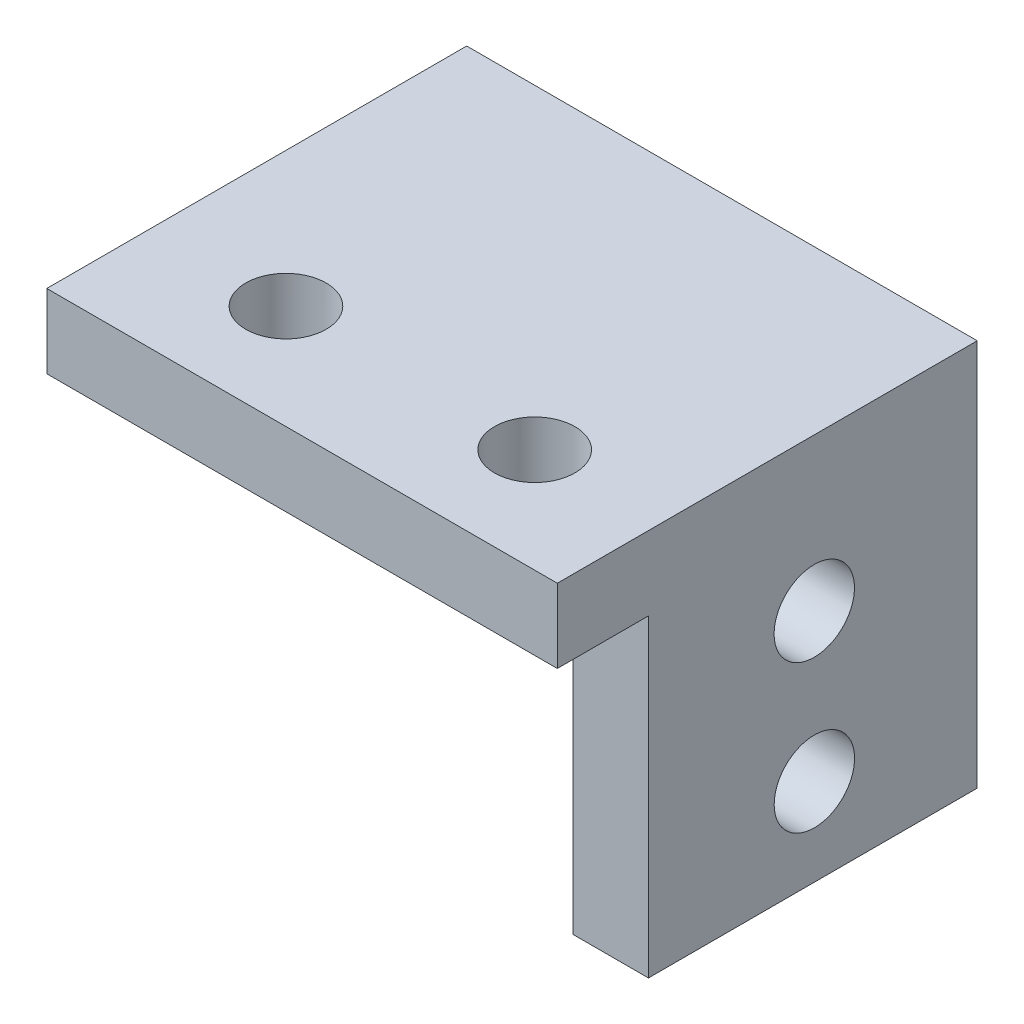
ISO-10303-21;
HEADER;
FILE_DESCRIPTION(('STEP AP214'),'2;1');
FILE_NAME('part.step','',(''),(''),'','','');
FILE_SCHEMA(('AUTOMOTIVE_DESIGN { 1 0 10303 214 1 1 1 1 }'));
ENDSEC;
DATA;
#1=APPLICATION_CONTEXT('core data for automotive mechanical design processes');
#2=APPLICATION_PROTOCOL_DEFINITION('international standard','automotive_design',2000,#1);
#3=PRODUCT_CONTEXT('',#1,'mechanical');
#4=PRODUCT('Part','Part','',(#3));
#5=PRODUCT_RELATED_PRODUCT_CATEGORY('part','',(#4));
#6=PRODUCT_DEFINITION_FORMATION('','',#4);
#7=PRODUCT_DEFINITION_CONTEXT('part definition',#1,'design');
#8=PRODUCT_DEFINITION('design','',#6,#7);
#9=PRODUCT_DEFINITION_SHAPE('','',#8);
#10=(LENGTH_UNIT() NAMED_UNIT(*) SI_UNIT(.MILLI.,.METRE.));
#11=(NAMED_UNIT(*) PLANE_ANGLE_UNIT() SI_UNIT($,.RADIAN.));
#12=(NAMED_UNIT(*) SI_UNIT($,.STERADIAN.) SOLID_ANGLE_UNIT());
#13=UNCERTAINTY_MEASURE_WITH_UNIT(LENGTH_MEASURE(1.E-05),#10,'distance_accuracy_value','');
#14=(GEOMETRIC_REPRESENTATION_CONTEXT(3) GLOBAL_UNCERTAINTY_ASSIGNED_CONTEXT((#13)) GLOBAL_UNIT_ASSIGNED_CONTEXT((#10,
#11,#12)) REPRESENTATION_CONTEXT('',''));
#15=CARTESIAN_POINT('',(0.,0.,0.));
#16=DIRECTION('',(0.,0.,1.));
#17=DIRECTION('',(1.,0.,0.));
#18=AXIS2_PLACEMENT_3D('',#15,#16,#17);
#19=CARTESIAN_POINT('',(0.,3.,0.));
#20=DIRECTION('',(1.,0.,0.));
#21=DIRECTION('',(0.,0.,-1.));
#22=AXIS2_PLACEMENT_3D('',#19,#20,#21);
#23=PLANE('',#22);
#24=DIRECTION('',(0.,0.,1.));
#25=VECTOR('',#24,1.);
#26=CARTESIAN_POINT('',(0.,2.94016660606976,0.));
#27=LINE('',#26,#25);
#28=CARTESIAN_POINT('',(0.,2.94016660606976,-16.7139999999922));
#29=VERTEX_POINT('',#28);
#30=CARTESIAN_POINT('',(0.,2.94016660606976,0.));
#31=VERTEX_POINT('',#30);
#32=EDGE_CURVE('E106',#29,#31,#27,.T.);
#33=ORIENTED_EDGE('',*,*,#32,.F.);
#34=DIRECTION('',(0.,-1.,0.));
#35=VECTOR('',#34,1.);
#36=CARTESIAN_POINT('',(0.,10.,-16.7139999999922));
#37=LINE('',#36,#35);
#38=CARTESIAN_POINT('',(0.,0.,-16.7139999999922));
#39=VERTEX_POINT('',#38);
#40=EDGE_CURVE('E46',#29,#39,#37,.T.);
#41=ORIENTED_EDGE('',*,*,#40,.T.);
#42=DIRECTION('',(0.,0.,1.));
#43=VECTOR('',#42,1.);
#44=CARTESIAN_POINT('',(0.,0.,0.));
#45=LINE('',#44,#43);
#46=CARTESIAN_POINT('',(0.,0.,0.));
#47=VERTEX_POINT('',#46);
#48=EDGE_CURVE('E104',#39,#47,#45,.T.);
#49=ORIENTED_EDGE('',*,*,#48,.T.);
#50=DIRECTION('',(0.,-1.,0.));
#51=VECTOR('',#50,1.);
#52=CARTESIAN_POINT('',(0.,3.,0.));
#53=LINE('',#52,#51);
#54=EDGE_CURVE('E123',#31,#47,#53,.T.);
#55=ORIENTED_EDGE('',*,*,#54,.F.);
#56=EDGE_LOOP('',(#33,#41,#49,#55));
#57=FACE_BOUND('',#56,.T.);
#58=ADVANCED_FACE('F33',(#57),#23,.F.);
#59=CARTESIAN_POINT('',(0.,3.,0.));
#60=DIRECTION('',(0.,0.,-1.));
#61=DIRECTION('',(-1.,0.,0.));
#62=AXIS2_PLACEMENT_3D('',#59,#60,#61);
#63=PLANE('',#62);
#64=DIRECTION('',(1.,0.,0.));
#65=VECTOR('',#64,1.);
#66=CARTESIAN_POINT('',(0.,2.94016660606976,0.));
#67=LINE('',#66,#65);
#68=CARTESIAN_POINT('',(20.32,2.94016660606976,0.));
#69=VERTEX_POINT('',#68);
#70=EDGE_CURVE('E158',#31,#69,#67,.T.);
#71=ORIENTED_EDGE('',*,*,#70,.F.);
#72=ORIENTED_EDGE('',*,*,#54,.T.);
#73=DIRECTION('',(1.,0.,0.));
#74=VECTOR('',#73,1.);
#75=CARTESIAN_POINT('',(0.,0.,0.));
#76=LINE('',#75,#74);
#77=CARTESIAN_POINT('',(20.32,0.,0.));
#78=VERTEX_POINT('',#77);
#79=EDGE_CURVE('E112',#47,#78,#76,.T.);
#80=ORIENTED_EDGE('',*,*,#79,.T.);
#81=DIRECTION('',(0.,-1.,0.));
#82=VECTOR('',#81,1.);
#83=CARTESIAN_POINT('',(20.32,3.,0.));
#84=LINE('',#83,#82);
#85=EDGE_CURVE('E54',#69,#78,#84,.T.);
#86=ORIENTED_EDGE('',*,*,#85,.F.);
#87=EDGE_LOOP('',(#71,#72,#80,#86));
#88=FACE_BOUND('',#87,.T.);
#89=ADVANCED_FACE('F162',(#88),#63,.F.);
#90=CARTESIAN_POINT('',(20.32,3.,0.));
#91=DIRECTION('',(-1.,0.,0.));
#92=DIRECTION('',(0.,0.,1.));
#93=AXIS2_PLACEMENT_3D('',#90,#91,#92);
#94=PLANE('',#93);
#95=CARTESIAN_POINT('',(20.32,-9.00652430289028,-10.232213562366));
#96=DIRECTION('',(-1.,0.,0.));
#97=DIRECTION('',(0.,0.,1.));
#98=AXIS2_PLACEMENT_3D('',#95,#96,#97);
#99=CIRCLE('',#98,1.6);
#100=CARTESIAN_POINT('',(20.32,-9.00652430289028,-8.632213562366));
#101=VERTEX_POINT('',#100);
#102=EDGE_CURVE('E210',#101,#101,#99,.T.);
#103=ORIENTED_EDGE('',*,*,#102,.T.);
#104=EDGE_LOOP('',(#103));
#105=FACE_BOUND('',#104,.T.);
#106=CARTESIAN_POINT('',(20.32,-3.12707400262724,-10.228213562366));
#107=DIRECTION('',(-1.,0.,0.));
#108=DIRECTION('',(0.,0.,1.));
#109=AXIS2_PLACEMENT_3D('',#106,#107,#108);
#110=CIRCLE('',#109,1.6);
#111=CARTESIAN_POINT('',(20.32,-3.12707400262724,-8.628213562366));
#112=VERTEX_POINT('',#111);
#113=EDGE_CURVE('E212',#112,#112,#110,.T.);
#114=ORIENTED_EDGE('',*,*,#113,.T.);
#115=EDGE_LOOP('',(#114));
#116=FACE_BOUND('',#115,.T.);
#117=DIRECTION('',(0.,1.,0.));
#118=VECTOR('',#117,1.);
#119=CARTESIAN_POINT('',(20.32,3.04016660606976,-16.7139999999922));
#120=LINE('',#119,#118);
#121=CARTESIAN_POINT('',(20.32,-12.4820995974346,-16.7139999999922));
#122=VERTEX_POINT('',#121);
#123=CARTESIAN_POINT('',(20.32,2.94016660606976,-16.7139999999922));
#124=VERTEX_POINT('',#123);
#125=EDGE_CURVE('E145',#122,#124,#120,.T.);
#126=ORIENTED_EDGE('',*,*,#125,.T.);
#127=DIRECTION('',(0.,0.,-1.));
#128=VECTOR('',#127,1.);
#129=CARTESIAN_POINT('',(20.32,2.94016660606976,0.));
#130=LINE('',#129,#128);
#131=EDGE_CURVE('E107',#69,#124,#130,.T.);
#132=ORIENTED_EDGE('',*,*,#131,.F.);
#133=ORIENTED_EDGE('',*,*,#85,.T.);
#134=DIRECTION('',(0.,0.,-1.));
#135=VECTOR('',#134,1.);
#136=CARTESIAN_POINT('',(20.32,0.,0.));
#137=LINE('',#136,#135);
#138=CARTESIAN_POINT('',(20.32,0.,-3.628213562366));
#139=VERTEX_POINT('',#138);
#140=EDGE_CURVE('E115',#78,#139,#137,.T.);
#141=ORIENTED_EDGE('',*,*,#140,.T.);
#142=DIRECTION('',(0.,-1.,0.));
#143=VECTOR('',#142,1.);
#144=CARTESIAN_POINT('',(20.32,3.04016660606976,-3.628213562366));
#145=LINE('',#144,#143);
#146=CARTESIAN_POINT('',(20.32,-12.4820995974346,-3.628213562366));
#147=VERTEX_POINT('',#146);
#148=EDGE_CURVE('E133',#139,#147,#145,.T.);
#149=ORIENTED_EDGE('',*,*,#148,.T.);
#150=DIRECTION('',(0.,0.,-1.));
#151=VECTOR('',#150,1.);
#152=CARTESIAN_POINT('',(20.32,-12.4820995974346,-16.7139999999922));
#153=LINE('',#152,#151);
#154=EDGE_CURVE('E141',#147,#122,#153,.T.);
#155=ORIENTED_EDGE('',*,*,#154,.T.);
#156=EDGE_LOOP('',(#126,#132,#133,#141,#149,#155));
#157=FACE_BOUND('',#156,.T.);
#158=ADVANCED_FACE('F150',(#105,#116,#157),#94,.F.);
#159=CARTESIAN_POINT('',(0.,0.,0.));
#160=DIRECTION('',(0.,-1.,0.));
#161=DIRECTION('',(0.,0.,-1.));
#162=AXIS2_PLACEMENT_3D('',#159,#160,#161);
#163=PLANE('',#162);
#164=CARTESIAN_POINT('',(5.36999999996643,0.,-4.14999999996696));
#165=DIRECTION('',(0.,-1.,0.));
#166=DIRECTION('',(0.,0.,-1.));
#167=AXIS2_PLACEMENT_3D('',#164,#165,#166);
#168=CIRCLE('',#167,1.6);
#169=CARTESIAN_POINT('',(5.36999999996643,0.,-5.74999999996696));
#170=VERTEX_POINT('',#169);
#171=EDGE_CURVE('E99',#170,#170,#168,.T.);
#172=ORIENTED_EDGE('',*,*,#171,.F.);
#173=EDGE_LOOP('',(#172));
#174=FACE_BOUND('',#173,.T.);
#175=CARTESIAN_POINT('',(15.2699999999664,0.,-4.1499999999671));
#176=DIRECTION('',(0.,-1.,0.));
#177=DIRECTION('',(0.,0.,-1.));
#178=AXIS2_PLACEMENT_3D('',#175,#176,#177);
#179=CIRCLE('',#178,1.6);
#180=CARTESIAN_POINT('',(15.2699999999664,0.,-5.7499999999671));
#181=VERTEX_POINT('',#180);
#182=EDGE_CURVE('E222',#181,#181,#179,.T.);
#183=ORIENTED_EDGE('',*,*,#182,.F.);
#184=EDGE_LOOP('',(#183));
#185=FACE_BOUND('',#184,.T.);
#186=DIRECTION('',(-1.,0.,0.));
#187=VECTOR('',#186,1.);
#188=CARTESIAN_POINT('',(0.,0.,-16.7139999999922));
#189=LINE('',#188,#187);
#190=CARTESIAN_POINT('',(17.32,0.,-16.7139999999922));
#191=VERTEX_POINT('',#190);
#192=EDGE_CURVE('E91',#191,#39,#189,.T.);
#193=ORIENTED_EDGE('',*,*,#192,.F.);
#194=DIRECTION('',(0.,0.,-1.));
#195=VECTOR('',#194,1.);
#196=CARTESIAN_POINT('',(17.32,0.,0.));
#197=LINE('',#196,#195);
#198=CARTESIAN_POINT('',(17.32,0.,-3.628213562366));
#199=VERTEX_POINT('',#198);
#200=EDGE_CURVE('E125',#199,#191,#197,.T.);
#201=ORIENTED_EDGE('',*,*,#200,.F.);
#202=DIRECTION('',(-1.,0.,0.));
#203=VECTOR('',#202,1.);
#204=CARTESIAN_POINT('',(0.,0.,-3.62821356236599));
#205=LINE('',#204,#203);
#206=EDGE_CURVE('E40',#139,#199,#205,.T.);
#207=ORIENTED_EDGE('',*,*,#206,.F.);
#208=ORIENTED_EDGE('',*,*,#140,.F.);
#209=ORIENTED_EDGE('',*,*,#79,.F.);
#210=ORIENTED_EDGE('',*,*,#48,.F.);
#211=EDGE_LOOP('',(#193,#201,#207,#208,#209,#210));
#212=FACE_BOUND('',#211,.T.);
#213=ADVANCED_FACE('F110',(#174,#185,#212),#163,.T.);
#214=CARTESIAN_POINT('',(17.32,-12.4820995974346,-16.7139999999922));
#215=DIRECTION('',(0.,-1.,0.));
#216=DIRECTION('',(0.,0.,-1.));
#217=AXIS2_PLACEMENT_3D('',#214,#215,#216);
#218=PLANE('',#217);
#219=ORIENTED_EDGE('',*,*,#154,.F.);
#220=DIRECTION('',(1.,0.,0.));
#221=VECTOR('',#220,1.);
#222=CARTESIAN_POINT('',(17.32,-12.4820995974346,-3.628213562366));
#223=LINE('',#222,#221);
#224=CARTESIAN_POINT('',(17.32,-12.4820995974346,-3.628213562366));
#225=VERTEX_POINT('',#224);
#226=EDGE_CURVE('E117',#225,#147,#223,.T.);
#227=ORIENTED_EDGE('',*,*,#226,.F.);
#228=DIRECTION('',(0.,0.,-1.));
#229=VECTOR('',#228,1.);
#230=CARTESIAN_POINT('',(17.32,-12.4820995974346,-16.7139999999922));
#231=LINE('',#230,#229);
#232=CARTESIAN_POINT('',(17.32,-12.4820995974346,-16.7139999999922));
#233=VERTEX_POINT('',#232);
#234=EDGE_CURVE('E138',#225,#233,#231,.T.);
#235=ORIENTED_EDGE('',*,*,#234,.T.);
#236=DIRECTION('',(1.,0.,0.));
#237=VECTOR('',#236,1.);
#238=CARTESIAN_POINT('',(17.32,-12.4820995974346,-16.7139999999922));
#239=LINE('',#238,#237);
#240=EDGE_CURVE('E113',#233,#122,#239,.T.);
#241=ORIENTED_EDGE('',*,*,#240,.T.);
#242=EDGE_LOOP('',(#219,#227,#235,#241));
#243=FACE_BOUND('',#242,.T.);
#244=ADVANCED_FACE('F153',(#243),#218,.T.);
#245=CARTESIAN_POINT('',(17.32,0.,0.));
#246=DIRECTION('',(-1.,0.,0.));
#247=DIRECTION('',(0.,0.,1.));
#248=AXIS2_PLACEMENT_3D('',#245,#246,#247);
#249=PLANE('',#248);
#250=CARTESIAN_POINT('',(17.32,-9.00652430289028,-10.232213562366));
#251=DIRECTION('',(-1.,0.,0.));
#252=DIRECTION('',(0.,0.,1.));
#253=AXIS2_PLACEMENT_3D('',#250,#251,#252);
#254=CIRCLE('',#253,1.6);
#255=CARTESIAN_POINT('',(17.32,-9.00652430289028,-8.63221356236599));
#256=VERTEX_POINT('',#255);
#257=EDGE_CURVE('E207',#256,#256,#254,.T.);
#258=ORIENTED_EDGE('',*,*,#257,.F.);
#259=EDGE_LOOP('',(#258));
#260=FACE_BOUND('',#259,.T.);
#261=CARTESIAN_POINT('',(17.32,-3.12707400262724,-10.228213562366));
#262=DIRECTION('',(-1.,0.,0.));
#263=DIRECTION('',(0.,0.,1.));
#264=AXIS2_PLACEMENT_3D('',#261,#262,#263);
#265=CIRCLE('',#264,1.6);
#266=CARTESIAN_POINT('',(17.32,-3.12707400262724,-8.62821356236599));
#267=VERTEX_POINT('',#266);
#268=EDGE_CURVE('E235',#267,#267,#265,.T.);
#269=ORIENTED_EDGE('',*,*,#268,.F.);
#270=EDGE_LOOP('',(#269));
#271=FACE_BOUND('',#270,.T.);
#272=DIRECTION('',(0.,-1.,0.));
#273=VECTOR('',#272,1.);
#274=CARTESIAN_POINT('',(17.32,3.04016660606976,-3.628213562366));
#275=LINE('',#274,#273);
#276=EDGE_CURVE('E131',#199,#225,#275,.T.);
#277=ORIENTED_EDGE('',*,*,#276,.F.);
#278=ORIENTED_EDGE('',*,*,#200,.T.);
#279=DIRECTION('',(0.,1.,0.));
#280=VECTOR('',#279,1.);
#281=CARTESIAN_POINT('',(17.32,3.04016660606976,-16.7139999999922));
#282=LINE('',#281,#280);
#283=EDGE_CURVE('E94',#233,#191,#282,.T.);
#284=ORIENTED_EDGE('',*,*,#283,.F.);
#285=ORIENTED_EDGE('',*,*,#234,.F.);
#286=EDGE_LOOP('',(#277,#278,#284,#285));
#287=FACE_BOUND('',#286,.T.);
#288=ADVANCED_FACE('F136',(#260,#271,#287),#249,.T.);
#289=CARTESIAN_POINT('',(17.32,3.04016660606976,-3.628213562366));
#290=DIRECTION('',(0.,0.,1.));
#291=DIRECTION('',(1.,0.,0.));
#292=AXIS2_PLACEMENT_3D('',#289,#290,#291);
#293=PLANE('',#292);
#294=ORIENTED_EDGE('',*,*,#148,.F.);
#295=ORIENTED_EDGE('',*,*,#206,.T.);
#296=ORIENTED_EDGE('',*,*,#276,.T.);
#297=ORIENTED_EDGE('',*,*,#226,.T.);
#298=EDGE_LOOP('',(#294,#295,#296,#297));
#299=FACE_BOUND('',#298,.T.);
#300=ADVANCED_FACE('F129',(#299),#293,.T.);
#301=CARTESIAN_POINT('',(17.32,3.04016660606976,-16.7139999999922));
#302=DIRECTION('',(0.,0.,-1.));
#303=DIRECTION('',(-1.,0.,0.));
#304=AXIS2_PLACEMENT_3D('',#301,#302,#303);
#305=PLANE('',#304);
#306=ORIENTED_EDGE('',*,*,#283,.T.);
#307=ORIENTED_EDGE('',*,*,#192,.T.);
#308=ORIENTED_EDGE('',*,*,#40,.F.);
#309=DIRECTION('',(1.,0.,0.));
#310=VECTOR('',#309,1.);
#311=CARTESIAN_POINT('',(0.,2.94016660606976,-16.7139999999922));
#312=LINE('',#311,#310);
#313=EDGE_CURVE('E11',#29,#124,#312,.T.);
#314=ORIENTED_EDGE('',*,*,#313,.T.);
#315=ORIENTED_EDGE('',*,*,#125,.F.);
#316=ORIENTED_EDGE('',*,*,#240,.F.);
#317=EDGE_LOOP('',(#306,#307,#308,#314,#315,#316));
#318=FACE_BOUND('',#317,.T.);
#319=ADVANCED_FACE('F92',(#318),#305,.T.);
#320=CARTESIAN_POINT('',(0.,2.94016660606976,0.));
#321=DIRECTION('',(0.,1.,0.));
#322=DIRECTION('',(0.,0.,1.));
#323=AXIS2_PLACEMENT_3D('',#320,#321,#322);
#324=PLANE('',#323);
#325=CARTESIAN_POINT('',(5.36999999996643,2.94016660606976,-4.14999999996696));
#326=DIRECTION('',(0.,1.,0.));
#327=DIRECTION('',(0.,0.,1.));
#328=AXIS2_PLACEMENT_3D('',#325,#326,#327);
#329=CIRCLE('',#328,1.6);
#330=CARTESIAN_POINT('',(5.36999999996643,2.94016660606976,-2.54999999996696));
#331=VERTEX_POINT('',#330);
#332=EDGE_CURVE('E215',#331,#331,#329,.T.);
#333=ORIENTED_EDGE('',*,*,#332,.F.);
#334=EDGE_LOOP('',(#333));
#335=FACE_BOUND('',#334,.T.);
#336=CARTESIAN_POINT('',(15.2699999999664,2.94016660606976,-4.1499999999671));
#337=DIRECTION('',(0.,1.,0.));
#338=DIRECTION('',(0.,0.,1.));
#339=AXIS2_PLACEMENT_3D('',#336,#337,#338);
#340=CIRCLE('',#339,1.6);
#341=CARTESIAN_POINT('',(15.2699999999664,2.94016660606976,-2.5499999999671));
#342=VERTEX_POINT('',#341);
#343=EDGE_CURVE('E211',#342,#342,#340,.T.);
#344=ORIENTED_EDGE('',*,*,#343,.F.);
#345=EDGE_LOOP('',(#344));
#346=FACE_BOUND('',#345,.T.);
#347=ORIENTED_EDGE('',*,*,#313,.F.);
#348=ORIENTED_EDGE('',*,*,#32,.T.);
#349=ORIENTED_EDGE('',*,*,#70,.T.);
#350=ORIENTED_EDGE('',*,*,#131,.T.);
#351=EDGE_LOOP('',(#347,#348,#349,#350));
#352=FACE_BOUND('',#351,.T.);
#353=ADVANCED_FACE('F156',(#335,#346,#352),#324,.T.);
#354=CARTESIAN_POINT('',(15.2699999999664,-7.05983339393024,-4.1499999999671));
#355=DIRECTION('',(0.,1.,0.));
#356=DIRECTION('',(0.,0.,1.));
#357=AXIS2_PLACEMENT_3D('',#354,#355,#356);
#358=CYLINDRICAL_SURFACE('',#357,1.6);
#359=ORIENTED_EDGE('',*,*,#182,.T.);
#360=EDGE_LOOP('',(#359));
#361=FACE_BOUND('',#360,.T.);
#362=ORIENTED_EDGE('',*,*,#343,.T.);
#363=EDGE_LOOP('',(#362));
#364=FACE_BOUND('',#363,.T.);
#365=ADVANCED_FACE('F186',(#361,#364),#358,.F.);
#366=CARTESIAN_POINT('',(5.36999999996643,-7.05983339393024,-4.14999999996696));
#367=DIRECTION('',(0.,1.,0.));
#368=DIRECTION('',(0.,0.,1.));
#369=AXIS2_PLACEMENT_3D('',#366,#367,#368);
#370=CYLINDRICAL_SURFACE('',#369,1.6);
#371=ORIENTED_EDGE('',*,*,#171,.T.);
#372=EDGE_LOOP('',(#371));
#373=FACE_BOUND('',#372,.T.);
#374=ORIENTED_EDGE('',*,*,#332,.T.);
#375=EDGE_LOOP('',(#374));
#376=FACE_BOUND('',#375,.T.);
#377=ADVANCED_FACE('F190',(#373,#376),#370,.F.);
#378=CARTESIAN_POINT('',(27.32,-3.12707400262724,-10.228213562366));
#379=DIRECTION('',(-1.,0.,0.));
#380=DIRECTION('',(0.,0.,1.));
#381=AXIS2_PLACEMENT_3D('',#378,#379,#380);
#382=CYLINDRICAL_SURFACE('',#381,1.6);
#383=ORIENTED_EDGE('',*,*,#268,.T.);
#384=EDGE_LOOP('',(#383));
#385=FACE_BOUND('',#384,.T.);
#386=ORIENTED_EDGE('',*,*,#113,.F.);
#387=EDGE_LOOP('',(#386));
#388=FACE_BOUND('',#387,.T.);
#389=ADVANCED_FACE('F194',(#385,#388),#382,.F.);
#390=CARTESIAN_POINT('',(27.32,-9.00652430289028,-10.232213562366));
#391=DIRECTION('',(-1.,0.,0.));
#392=DIRECTION('',(0.,0.,1.));
#393=AXIS2_PLACEMENT_3D('',#390,#391,#392);
#394=CYLINDRICAL_SURFACE('',#393,1.6);
#395=ORIENTED_EDGE('',*,*,#257,.T.);
#396=EDGE_LOOP('',(#395));
#397=FACE_BOUND('',#396,.T.);
#398=ORIENTED_EDGE('',*,*,#102,.F.);
#399=EDGE_LOOP('',(#398));
#400=FACE_BOUND('',#399,.T.);
#401=ADVANCED_FACE('F198',(#397,#400),#394,.F.);
#402=CLOSED_SHELL('',(#58,#89,#158,#213,#244,#288,#300,#319,#353,#365,#377,#389,#401));
#403=MANIFOLD_SOLID_BREP('B2',#402);
#404=ADVANCED_BREP_SHAPE_REPRESENTATION('',(#18,#403),#14);
#405=SHAPE_DEFINITION_REPRESENTATION(#9,#404);
ENDSEC;
END-ISO-10303-21;
